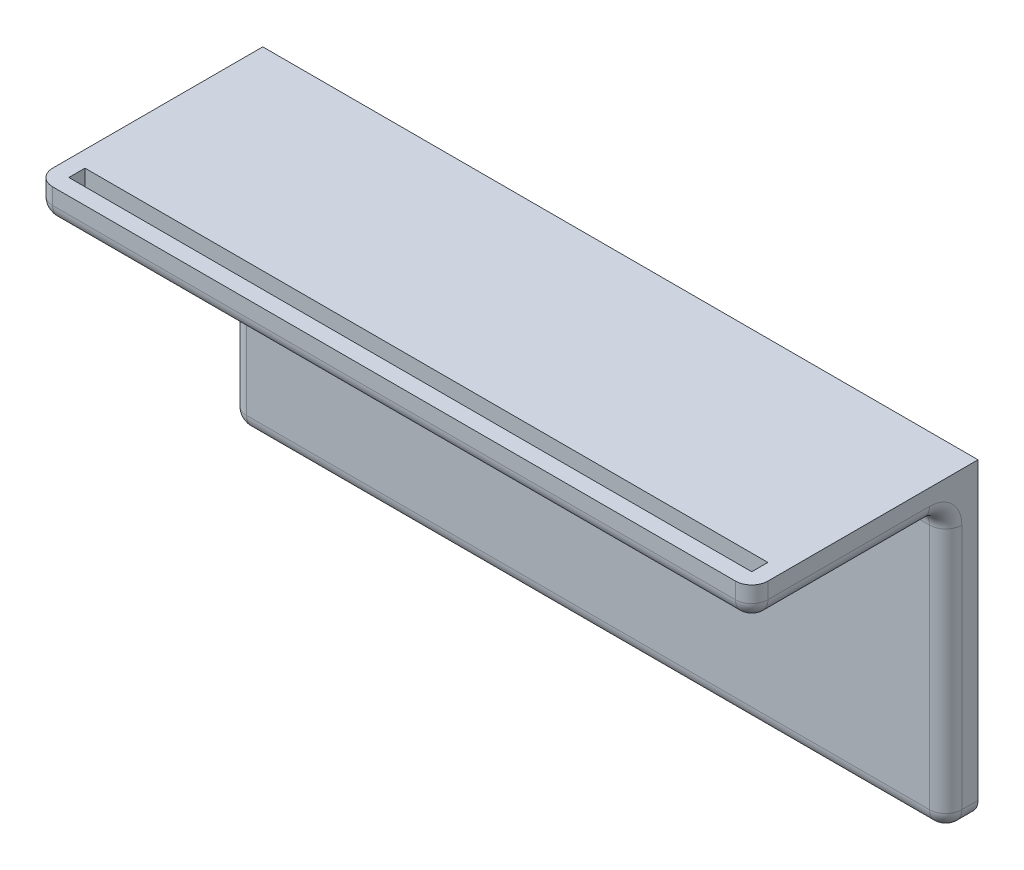
ISO-10303-21;
HEADER;
FILE_DESCRIPTION(('STEP AP214'),'2;1');
FILE_NAME('part.step','',(''),(''),'','','');
FILE_SCHEMA(('AUTOMOTIVE_DESIGN { 1 0 10303 214 1 1 1 1 }'));
ENDSEC;
DATA;
#1=APPLICATION_CONTEXT('core data for automotive mechanical design processes');
#2=APPLICATION_PROTOCOL_DEFINITION('international standard','automotive_design',2000,#1);
#3=PRODUCT_CONTEXT('',#1,'mechanical');
#4=PRODUCT('Part','Part','',(#3));
#5=PRODUCT_RELATED_PRODUCT_CATEGORY('part','',(#4));
#6=PRODUCT_DEFINITION_FORMATION('','',#4);
#7=PRODUCT_DEFINITION_CONTEXT('part definition',#1,'design');
#8=PRODUCT_DEFINITION('design','',#6,#7);
#9=PRODUCT_DEFINITION_SHAPE('','',#8);
#10=(LENGTH_UNIT() NAMED_UNIT(*) SI_UNIT(.MILLI.,.METRE.));
#11=(NAMED_UNIT(*) PLANE_ANGLE_UNIT() SI_UNIT($,.RADIAN.));
#12=(NAMED_UNIT(*) SI_UNIT($,.STERADIAN.) SOLID_ANGLE_UNIT());
#13=UNCERTAINTY_MEASURE_WITH_UNIT(LENGTH_MEASURE(1.E-05),#10,'distance_accuracy_value','');
#14=(GEOMETRIC_REPRESENTATION_CONTEXT(3) GLOBAL_UNCERTAINTY_ASSIGNED_CONTEXT((#13)) GLOBAL_UNIT_ASSIGNED_CONTEXT((#10,
#11,#12)) REPRESENTATION_CONTEXT('',''));
#15=CARTESIAN_POINT('',(0.,0.,0.));
#16=DIRECTION('',(0.,0.,1.));
#17=DIRECTION('',(1.,0.,0.));
#18=AXIS2_PLACEMENT_3D('',#15,#16,#17);
#19=CARTESIAN_POINT('',(-44.25,19.25,28.));
#20=DIRECTION('',(0.,-1.,0.));
#21=DIRECTION('',(1.,0.,0.));
#22=AXIS2_PLACEMENT_3D('',#19,#20,#21);
#23=PLANE('',#22);
#24=DIRECTION('',(1.,0.,0.));
#25=VECTOR('',#24,1.);
#26=CARTESIAN_POINT('',(42.25,19.25,26.));
#27=LINE('',#26,#25);
#28=CARTESIAN_POINT('',(-42.25,19.25,26.));
#29=VERTEX_POINT('',#28);
#30=CARTESIAN_POINT('',(42.25,19.25,26.));
#31=VERTEX_POINT('',#30);
#32=EDGE_CURVE('E217',#29,#31,#27,.T.);
#33=ORIENTED_EDGE('',*,*,#32,.F.);
#34=DIRECTION('',(0.,0.,1.));
#35=VECTOR('',#34,1.);
#36=CARTESIAN_POINT('',(-42.25,19.25,26.));
#37=LINE('',#36,#35);
#38=CARTESIAN_POINT('',(-42.25,19.25,24.));
#39=VERTEX_POINT('',#38);
#40=EDGE_CURVE('E65',#39,#29,#37,.T.);
#41=ORIENTED_EDGE('',*,*,#40,.F.);
#42=DIRECTION('',(-1.,0.,0.));
#43=VECTOR('',#42,1.);
#44=CARTESIAN_POINT('',(-42.25,19.25,24.));
#45=LINE('',#44,#43);
#46=CARTESIAN_POINT('',(42.25,19.25,24.));
#47=VERTEX_POINT('',#46);
#48=EDGE_CURVE('E204',#47,#39,#45,.T.);
#49=ORIENTED_EDGE('',*,*,#48,.F.);
#50=DIRECTION('',(0.,0.,-1.));
#51=VECTOR('',#50,1.);
#52=CARTESIAN_POINT('',(42.25,19.25,26.));
#53=LINE('',#52,#51);
#54=EDGE_CURVE('E208',#31,#47,#53,.T.);
#55=ORIENTED_EDGE('',*,*,#54,.F.);
#56=EDGE_LOOP('',(#33,#41,#49,#55));
#57=FACE_BOUND('',#56,.T.);
#58=DIRECTION('',(0.,0.,-1.));
#59=VECTOR('',#58,1.);
#60=CARTESIAN_POINT('',(-44.25,19.25,28.));
#61=LINE('',#60,#59);
#62=CARTESIAN_POINT('',(-44.25,19.25,26.));
#63=VERTEX_POINT('',#62);
#64=CARTESIAN_POINT('',(-44.25,19.25,0.));
#65=VERTEX_POINT('',#64);
#66=EDGE_CURVE('E255',#63,#65,#61,.T.);
#67=ORIENTED_EDGE('',*,*,#66,.F.);
#68=CARTESIAN_POINT('',(-42.25,19.25,26.));
#69=DIRECTION('',(0.,-1.,0.));
#70=DIRECTION('',(1.,0.,0.));
#71=AXIS2_PLACEMENT_3D('',#68,#69,#70);
#72=CIRCLE('',#71,2.);
#73=CARTESIAN_POINT('',(-42.25,19.25,28.));
#74=VERTEX_POINT('',#73);
#75=EDGE_CURVE('E373',#63,#74,#72,.F.);
#76=ORIENTED_EDGE('',*,*,#75,.T.);
#77=DIRECTION('',(-1.,0.,0.));
#78=VECTOR('',#77,1.);
#79=CARTESIAN_POINT('',(-44.25,19.25,28.));
#80=LINE('',#79,#78);
#81=CARTESIAN_POINT('',(42.25,19.25,28.));
#82=VERTEX_POINT('',#81);
#83=EDGE_CURVE('E232',#82,#74,#80,.T.);
#84=ORIENTED_EDGE('',*,*,#83,.F.);
#85=CARTESIAN_POINT('',(42.25,19.25,26.));
#86=DIRECTION('',(0.,-1.,0.));
#87=DIRECTION('',(1.,0.,0.));
#88=AXIS2_PLACEMENT_3D('',#85,#86,#87);
#89=CIRCLE('',#88,2.);
#90=CARTESIAN_POINT('',(44.25,19.25,26.));
#91=VERTEX_POINT('',#90);
#92=EDGE_CURVE('E282',#82,#91,#89,.F.);
#93=ORIENTED_EDGE('',*,*,#92,.T.);
#94=DIRECTION('',(0.,0.,-1.));
#95=VECTOR('',#94,1.);
#96=CARTESIAN_POINT('',(44.25,19.25,28.));
#97=LINE('',#96,#95);
#98=CARTESIAN_POINT('',(44.25,19.25,0.));
#99=VERTEX_POINT('',#98);
#100=EDGE_CURVE('E236',#91,#99,#97,.T.);
#101=ORIENTED_EDGE('',*,*,#100,.T.);
#102=DIRECTION('',(-1.,0.,0.));
#103=VECTOR('',#102,1.);
#104=CARTESIAN_POINT('',(-44.25,19.25,0.));
#105=LINE('',#104,#103);
#106=EDGE_CURVE('E238',#99,#65,#105,.T.);
#107=ORIENTED_EDGE('',*,*,#106,.T.);
#108=EDGE_LOOP('',(#67,#76,#84,#93,#101,#107));
#109=FACE_BOUND('',#108,.T.);
#110=ADVANCED_FACE('F47',(#57,#109),#23,.F.);
#111=CARTESIAN_POINT('',(-44.25,-19.25,28.));
#112=DIRECTION('',(1.,0.,0.));
#113=DIRECTION('',(0.,0.,-1.));
#114=AXIS2_PLACEMENT_3D('',#111,#112,#113);
#115=PLANE('',#114);
#116=DIRECTION('',(0.,-1.,0.));
#117=VECTOR('',#116,1.);
#118=CARTESIAN_POINT('',(-44.25,-19.25,0.));
#119=LINE('',#118,#117);
#120=CARTESIAN_POINT('',(-44.25,-17.25,0.));
#121=VERTEX_POINT('',#120);
#122=EDGE_CURVE('E242',#65,#121,#119,.T.);
#123=ORIENTED_EDGE('',*,*,#122,.T.);
#124=DIRECTION('',(0.,0.,-1.));
#125=VECTOR('',#124,1.);
#126=CARTESIAN_POINT('',(-44.25,-17.25,28.));
#127=LINE('',#126,#125);
#128=CARTESIAN_POINT('',(-44.25,-17.25,2.));
#129=VERTEX_POINT('',#128);
#130=EDGE_CURVE('E367',#121,#129,#127,.F.);
#131=ORIENTED_EDGE('',*,*,#130,.T.);
#132=DIRECTION('',(0.,1.,0.));
#133=VECTOR('',#132,1.);
#134=CARTESIAN_POINT('',(-44.25,-19.25,2.));
#135=LINE('',#134,#133);
#136=CARTESIAN_POINT('',(-44.25,13.25,2.));
#137=VERTEX_POINT('',#136);
#138=EDGE_CURVE('E361',#129,#137,#135,.T.);
#139=ORIENTED_EDGE('',*,*,#138,.T.);
#140=CARTESIAN_POINT('',(-44.25,13.25,6.));
#141=DIRECTION('',(1.,0.,0.));
#142=DIRECTION('',(0.,0.,-1.));
#143=AXIS2_PLACEMENT_3D('',#140,#141,#142);
#144=CIRCLE('',#143,4.);
#145=CARTESIAN_POINT('',(-44.25,17.25,6.));
#146=VERTEX_POINT('',#145);
#147=EDGE_CURVE('E358',#137,#146,#144,.T.);
#148=ORIENTED_EDGE('',*,*,#147,.T.);
#149=DIRECTION('',(0.,0.,1.));
#150=VECTOR('',#149,1.);
#151=CARTESIAN_POINT('',(-44.25,17.25,28.));
#152=LINE('',#151,#150);
#153=CARTESIAN_POINT('',(-44.25,17.25,26.));
#154=VERTEX_POINT('',#153);
#155=EDGE_CURVE('E355',#146,#154,#152,.T.);
#156=ORIENTED_EDGE('',*,*,#155,.T.);
#157=DIRECTION('',(0.,-1.,0.));
#158=VECTOR('',#157,1.);
#159=CARTESIAN_POINT('',(-44.25,19.25,26.));
#160=LINE('',#159,#158);
#161=EDGE_CURVE('E364',#154,#63,#160,.F.);
#162=ORIENTED_EDGE('',*,*,#161,.T.);
#163=ORIENTED_EDGE('',*,*,#66,.T.);
#164=EDGE_LOOP('',(#123,#131,#139,#148,#156,#162,#163));
#165=FACE_BOUND('',#164,.T.);
#166=ADVANCED_FACE('F419',(#165),#115,.F.);
#167=CARTESIAN_POINT('',(-44.25,-19.25,28.));
#168=DIRECTION('',(0.,1.,0.));
#169=DIRECTION('',(-1.,0.,0.));
#170=AXIS2_PLACEMENT_3D('',#167,#168,#169);
#171=PLANE('',#170);
#172=DIRECTION('',(1.,0.,0.));
#173=VECTOR('',#172,1.);
#174=CARTESIAN_POINT('',(-44.25,-19.25,2.));
#175=LINE('',#174,#173);
#176=CARTESIAN_POINT('',(42.25,-19.25,2.));
#177=VERTEX_POINT('',#176);
#178=CARTESIAN_POINT('',(-42.25,-19.25,2.));
#179=VERTEX_POINT('',#178);
#180=EDGE_CURVE('E274',#177,#179,#175,.F.);
#181=ORIENTED_EDGE('',*,*,#180,.T.);
#182=DIRECTION('',(0.,0.,-1.));
#183=VECTOR('',#182,1.);
#184=CARTESIAN_POINT('',(-42.25,-19.25,28.));
#185=LINE('',#184,#183);
#186=CARTESIAN_POINT('',(-42.25,-19.25,0.));
#187=VERTEX_POINT('',#186);
#188=EDGE_CURVE('E325',#179,#187,#185,.T.);
#189=ORIENTED_EDGE('',*,*,#188,.T.);
#190=DIRECTION('',(1.,0.,0.));
#191=VECTOR('',#190,1.);
#192=CARTESIAN_POINT('',(-44.25,-19.25,0.));
#193=LINE('',#192,#191);
#194=CARTESIAN_POINT('',(42.25,-19.25,0.));
#195=VERTEX_POINT('',#194);
#196=EDGE_CURVE('E247',#187,#195,#193,.T.);
#197=ORIENTED_EDGE('',*,*,#196,.T.);
#198=DIRECTION('',(0.,0.,-1.));
#199=VECTOR('',#198,1.);
#200=CARTESIAN_POINT('',(42.25,-19.25,28.));
#201=LINE('',#200,#199);
#202=EDGE_CURVE('E308',#195,#177,#201,.F.);
#203=ORIENTED_EDGE('',*,*,#202,.T.);
#204=EDGE_LOOP('',(#181,#189,#197,#203));
#205=FACE_BOUND('',#204,.T.);
#206=ADVANCED_FACE('F500',(#205),#171,.F.);
#207=CARTESIAN_POINT('',(44.25,-19.25,28.));
#208=DIRECTION('',(-1.,0.,0.));
#209=DIRECTION('',(0.,0.,1.));
#210=AXIS2_PLACEMENT_3D('',#207,#208,#209);
#211=PLANE('',#210);
#212=ORIENTED_EDGE('',*,*,#100,.F.);
#213=DIRECTION('',(0.,1.,0.));
#214=VECTOR('',#213,1.);
#215=CARTESIAN_POINT('',(44.25,17.25,26.));
#216=LINE('',#215,#214);
#217=CARTESIAN_POINT('',(44.25,17.25,26.));
#218=VERTEX_POINT('',#217);
#219=EDGE_CURVE('E297',#91,#218,#216,.F.);
#220=ORIENTED_EDGE('',*,*,#219,.T.);
#221=DIRECTION('',(0.,0.,1.));
#222=VECTOR('',#221,1.);
#223=CARTESIAN_POINT('',(44.25,17.25,28.));
#224=LINE('',#223,#222);
#225=CARTESIAN_POINT('',(44.25,17.25,6.));
#226=VERTEX_POINT('',#225);
#227=EDGE_CURVE('E291',#218,#226,#224,.F.);
#228=ORIENTED_EDGE('',*,*,#227,.T.);
#229=CARTESIAN_POINT('',(44.25,13.25,6.));
#230=DIRECTION('',(-1.,0.,0.));
#231=DIRECTION('',(0.,0.,1.));
#232=AXIS2_PLACEMENT_3D('',#229,#230,#231);
#233=CIRCLE('',#232,4.);
#234=CARTESIAN_POINT('',(44.25,13.25,2.));
#235=VERTEX_POINT('',#234);
#236=EDGE_CURVE('E288',#226,#235,#233,.T.);
#237=ORIENTED_EDGE('',*,*,#236,.T.);
#238=DIRECTION('',(0.,1.,0.));
#239=VECTOR('',#238,1.);
#240=CARTESIAN_POINT('',(44.25,-19.25,2.));
#241=LINE('',#240,#239);
#242=CARTESIAN_POINT('',(44.25,-17.25,2.));
#243=VERTEX_POINT('',#242);
#244=EDGE_CURVE('E285',#235,#243,#241,.F.);
#245=ORIENTED_EDGE('',*,*,#244,.T.);
#246=DIRECTION('',(0.,0.,-1.));
#247=VECTOR('',#246,1.);
#248=CARTESIAN_POINT('',(44.25,-17.25,28.));
#249=LINE('',#248,#247);
#250=CARTESIAN_POINT('',(44.25,-17.25,0.));
#251=VERTEX_POINT('',#250);
#252=EDGE_CURVE('E294',#243,#251,#249,.T.);
#253=ORIENTED_EDGE('',*,*,#252,.T.);
#254=DIRECTION('',(0.,1.,0.));
#255=VECTOR('',#254,1.);
#256=CARTESIAN_POINT('',(44.25,-19.25,0.));
#257=LINE('',#256,#255);
#258=EDGE_CURVE('E237',#251,#99,#257,.T.);
#259=ORIENTED_EDGE('',*,*,#258,.T.);
#260=EDGE_LOOP('',(#212,#220,#228,#237,#245,#253,#259));
#261=FACE_BOUND('',#260,.T.);
#262=ADVANCED_FACE('F479',(#261),#211,.F.);
#263=CARTESIAN_POINT('',(0.,0.,28.));
#264=DIRECTION('',(0.,0.,1.));
#265=DIRECTION('',(1.,0.,0.));
#266=AXIS2_PLACEMENT_3D('',#263,#264,#265);
#267=PLANE('',#266);
#268=ORIENTED_EDGE('',*,*,#83,.T.);
#269=DIRECTION('',(0.,-1.,0.));
#270=VECTOR('',#269,1.);
#271=CARTESIAN_POINT('',(-42.25,17.25,28.));
#272=LINE('',#271,#270);
#273=CARTESIAN_POINT('',(-42.25,17.25,28.));
#274=VERTEX_POINT('',#273);
#275=EDGE_CURVE('E370',#74,#274,#272,.T.);
#276=ORIENTED_EDGE('',*,*,#275,.T.);
#277=DIRECTION('',(1.,0.,0.));
#278=VECTOR('',#277,1.);
#279=CARTESIAN_POINT('',(44.25,17.25,28.));
#280=LINE('',#279,#278);
#281=CARTESIAN_POINT('',(42.25,17.25,28.));
#282=VERTEX_POINT('',#281);
#283=EDGE_CURVE('E265',#274,#282,#280,.T.);
#284=ORIENTED_EDGE('',*,*,#283,.T.);
#285=DIRECTION('',(0.,1.,0.));
#286=VECTOR('',#285,1.);
#287=CARTESIAN_POINT('',(42.25,19.25,28.));
#288=LINE('',#287,#286);
#289=EDGE_CURVE('E278',#282,#82,#288,.T.);
#290=ORIENTED_EDGE('',*,*,#289,.T.);
#291=EDGE_LOOP('',(#268,#276,#284,#290));
#292=FACE_BOUND('',#291,.T.);
#293=ADVANCED_FACE('F477',(#292),#267,.T.);
#294=CARTESIAN_POINT('',(0.,0.,0.));
#295=DIRECTION('',(0.,0.,1.));
#296=DIRECTION('',(1.,0.,0.));
#297=AXIS2_PLACEMENT_3D('',#294,#295,#296);
#298=PLANE('',#297);
#299=ORIENTED_EDGE('',*,*,#196,.F.);
#300=CARTESIAN_POINT('',(-42.25,-17.25,0.));
#301=DIRECTION('',(0.,0.,1.));
#302=DIRECTION('',(1.,0.,0.));
#303=AXIS2_PLACEMENT_3D('',#300,#301,#302);
#304=CIRCLE('',#303,2.);
#305=EDGE_CURVE('E352',#187,#121,#304,.F.);
#306=ORIENTED_EDGE('',*,*,#305,.T.);
#307=ORIENTED_EDGE('',*,*,#122,.F.);
#308=ORIENTED_EDGE('',*,*,#106,.F.);
#309=ORIENTED_EDGE('',*,*,#258,.F.);
#310=CARTESIAN_POINT('',(42.25,-17.25,0.));
#311=DIRECTION('',(0.,0.,1.));
#312=DIRECTION('',(1.,0.,0.));
#313=AXIS2_PLACEMENT_3D('',#310,#311,#312);
#314=CIRCLE('',#313,2.);
#315=EDGE_CURVE('E304',#251,#195,#314,.F.);
#316=ORIENTED_EDGE('',*,*,#315,.T.);
#317=EDGE_LOOP('',(#299,#306,#307,#308,#309,#316));
#318=FACE_BOUND('',#317,.T.);
#319=ADVANCED_FACE('F428',(#318),#298,.F.);
#320=CARTESIAN_POINT('',(-44.25,15.25,4.));
#321=DIRECTION('',(0.,1.,0.));
#322=DIRECTION('',(0.,0.,1.));
#323=AXIS2_PLACEMENT_3D('',#320,#321,#322);
#324=PLANE('',#323);
#325=DIRECTION('',(1.,0.,0.));
#326=VECTOR('',#325,1.);
#327=CARTESIAN_POINT('',(-44.25,15.25,26.));
#328=LINE('',#327,#326);
#329=CARTESIAN_POINT('',(42.25,15.25,26.));
#330=VERTEX_POINT('',#329);
#331=CARTESIAN_POINT('',(-42.25,15.25,26.));
#332=VERTEX_POINT('',#331);
#333=EDGE_CURVE('E268',#330,#332,#328,.F.);
#334=ORIENTED_EDGE('',*,*,#333,.T.);
#335=DIRECTION('',(0.,0.,1.));
#336=VECTOR('',#335,1.);
#337=CARTESIAN_POINT('',(-42.25,15.25,4.));
#338=LINE('',#337,#336);
#339=CARTESIAN_POINT('',(-42.25,15.25,6.));
#340=VERTEX_POINT('',#339);
#341=EDGE_CURVE('E57',#332,#340,#338,.F.);
#342=ORIENTED_EDGE('',*,*,#341,.T.);
#343=DIRECTION('',(1.,0.,0.));
#344=VECTOR('',#343,1.);
#345=CARTESIAN_POINT('',(44.25,15.25,6.));
#346=LINE('',#345,#344);
#347=CARTESIAN_POINT('',(42.25,15.25,6.));
#348=VERTEX_POINT('',#347);
#349=EDGE_CURVE('E258',#340,#348,#346,.T.);
#350=ORIENTED_EDGE('',*,*,#349,.T.);
#351=DIRECTION('',(0.,0.,1.));
#352=VECTOR('',#351,1.);
#353=CARTESIAN_POINT('',(42.25,15.25,4.));
#354=LINE('',#353,#352);
#355=EDGE_CURVE('E311',#348,#330,#354,.T.);
#356=ORIENTED_EDGE('',*,*,#355,.T.);
#357=EDGE_LOOP('',(#334,#342,#350,#356));
#358=FACE_BOUND('',#357,.T.);
#359=ADVANCED_FACE('F452',(#358),#324,.F.);
#360=CARTESIAN_POINT('',(-44.25,-19.25,4.));
#361=DIRECTION('',(0.,0.,-1.));
#362=DIRECTION('',(-1.,0.,0.));
#363=AXIS2_PLACEMENT_3D('',#360,#361,#362);
#364=PLANE('',#363);
#365=DIRECTION('',(1.,0.,0.));
#366=VECTOR('',#365,1.);
#367=CARTESIAN_POINT('',(-44.25,13.25,4.));
#368=LINE('',#367,#366);
#369=CARTESIAN_POINT('',(42.25,13.25,4.));
#370=VERTEX_POINT('',#369);
#371=CARTESIAN_POINT('',(-42.25,13.25,4.));
#372=VERTEX_POINT('',#371);
#373=EDGE_CURVE('E261',#370,#372,#368,.F.);
#374=ORIENTED_EDGE('',*,*,#373,.T.);
#375=DIRECTION('',(0.,1.,0.));
#376=VECTOR('',#375,1.);
#377=CARTESIAN_POINT('',(-42.25,-19.25,4.));
#378=LINE('',#377,#376);
#379=CARTESIAN_POINT('',(-42.25,-17.25,4.));
#380=VERTEX_POINT('',#379);
#381=EDGE_CURVE('E379',#372,#380,#378,.F.);
#382=ORIENTED_EDGE('',*,*,#381,.T.);
#383=DIRECTION('',(1.,0.,0.));
#384=VECTOR('',#383,1.);
#385=CARTESIAN_POINT('',(-44.25,-17.25,4.));
#386=LINE('',#385,#384);
#387=CARTESIAN_POINT('',(42.25,-17.25,4.));
#388=VERTEX_POINT('',#387);
#389=EDGE_CURVE('E271',#380,#388,#386,.T.);
#390=ORIENTED_EDGE('',*,*,#389,.T.);
#391=DIRECTION('',(0.,1.,0.));
#392=VECTOR('',#391,1.);
#393=CARTESIAN_POINT('',(42.25,-19.25,4.));
#394=LINE('',#393,#392);
#395=EDGE_CURVE('E318',#388,#370,#394,.T.);
#396=ORIENTED_EDGE('',*,*,#395,.T.);
#397=EDGE_LOOP('',(#374,#382,#390,#396));
#398=FACE_BOUND('',#397,.T.);
#399=ADVANCED_FACE('F494',(#398),#364,.F.);
#400=CARTESIAN_POINT('',(-44.25,13.25,6.));
#401=DIRECTION('',(-1.,0.,0.));
#402=DIRECTION('',(0.,0.,1.));
#403=AXIS2_PLACEMENT_3D('',#400,#401,#402);
#404=CYLINDRICAL_SURFACE('',#403,2.);
#405=ORIENTED_EDGE('',*,*,#349,.F.);
#406=CARTESIAN_POINT('',(-42.25,13.25,6.));
#407=DIRECTION('',(1.,0.,0.));
#408=DIRECTION('',(0.,0.,-1.));
#409=AXIS2_PLACEMENT_3D('',#406,#407,#408);
#410=CIRCLE('',#409,2.);
#411=EDGE_CURVE('E382',#340,#372,#410,.F.);
#412=ORIENTED_EDGE('',*,*,#411,.T.);
#413=ORIENTED_EDGE('',*,*,#373,.F.);
#414=CARTESIAN_POINT('',(42.25,13.25,6.));
#415=DIRECTION('',(-1.,0.,0.));
#416=DIRECTION('',(0.,0.,1.));
#417=AXIS2_PLACEMENT_3D('',#414,#415,#416);
#418=CIRCLE('',#417,2.);
#419=EDGE_CURVE('E314',#370,#348,#418,.F.);
#420=ORIENTED_EDGE('',*,*,#419,.T.);
#421=EDGE_LOOP('',(#405,#412,#413,#420));
#422=FACE_BOUND('',#421,.T.);
#423=ADVANCED_FACE('F454',(#422),#404,.F.);
#424=CARTESIAN_POINT('',(0.,17.25,26.));
#425=DIRECTION('',(-1.,0.,0.));
#426=DIRECTION('',(0.,0.,1.));
#427=AXIS2_PLACEMENT_3D('',#424,#425,#426);
#428=CYLINDRICAL_SURFACE('',#427,2.);
#429=ORIENTED_EDGE('',*,*,#283,.F.);
#430=CARTESIAN_POINT('',(-42.25,17.25,26.));
#431=DIRECTION('',(-1.,0.,0.));
#432=DIRECTION('',(0.,0.,1.));
#433=AXIS2_PLACEMENT_3D('',#430,#431,#432);
#434=CIRCLE('',#433,2.);
#435=EDGE_CURVE('E11',#274,#332,#434,.F.);
#436=ORIENTED_EDGE('',*,*,#435,.T.);
#437=ORIENTED_EDGE('',*,*,#333,.F.);
#438=CARTESIAN_POINT('',(42.25,17.25,26.));
#439=DIRECTION('',(-1.,0.,0.));
#440=DIRECTION('',(0.,0.,1.));
#441=AXIS2_PLACEMENT_3D('',#438,#439,#440);
#442=CIRCLE('',#441,2.);
#443=EDGE_CURVE('E300',#330,#282,#442,.T.);
#444=ORIENTED_EDGE('',*,*,#443,.T.);
#445=EDGE_LOOP('',(#429,#436,#437,#444));
#446=FACE_BOUND('',#445,.T.);
#447=ADVANCED_FACE('F468',(#446),#428,.T.);
#448=CARTESIAN_POINT('',(-44.25,-17.25,2.));
#449=DIRECTION('',(1.,0.,0.));
#450=DIRECTION('',(0.,1.,0.));
#451=AXIS2_PLACEMENT_3D('',#448,#449,#450);
#452=CYLINDRICAL_SURFACE('',#451,2.);
#453=ORIENTED_EDGE('',*,*,#389,.F.);
#454=CARTESIAN_POINT('',(-42.25,-17.25,2.));
#455=DIRECTION('',(1.,0.,0.));
#456=DIRECTION('',(0.,1.,0.));
#457=AXIS2_PLACEMENT_3D('',#454,#455,#456);
#458=CIRCLE('',#457,2.);
#459=EDGE_CURVE('E376',#380,#179,#458,.T.);
#460=ORIENTED_EDGE('',*,*,#459,.T.);
#461=ORIENTED_EDGE('',*,*,#180,.F.);
#462=CARTESIAN_POINT('',(42.25,-17.25,2.));
#463=DIRECTION('',(1.,0.,0.));
#464=DIRECTION('',(0.,1.,0.));
#465=AXIS2_PLACEMENT_3D('',#462,#463,#464);
#466=CIRCLE('',#465,2.);
#467=EDGE_CURVE('E321',#177,#388,#466,.F.);
#468=ORIENTED_EDGE('',*,*,#467,.T.);
#469=EDGE_LOOP('',(#453,#460,#461,#468));
#470=FACE_BOUND('',#469,.T.);
#471=ADVANCED_FACE('F498',(#470),#452,.T.);
#472=CARTESIAN_POINT('',(42.25,-17.25,28.));
#473=DIRECTION('',(0.,0.,-1.));
#474=DIRECTION('',(-1.,0.,0.));
#475=AXIS2_PLACEMENT_3D('',#472,#473,#474);
#476=CYLINDRICAL_SURFACE('',#475,2.);
#477=CARTESIAN_POINT('',(42.25,-17.25,2.));
#478=DIRECTION('',(0.,0.,1.));
#479=DIRECTION('',(1.,0.,0.));
#480=AXIS2_PLACEMENT_3D('',#477,#478,#479);
#481=CIRCLE('',#480,2.);
#482=EDGE_CURVE('E243',#177,#243,#481,.T.);
#483=ORIENTED_EDGE('',*,*,#482,.F.);
#484=ORIENTED_EDGE('',*,*,#202,.F.);
#485=ORIENTED_EDGE('',*,*,#315,.F.);
#486=ORIENTED_EDGE('',*,*,#252,.F.);
#487=EDGE_LOOP('',(#483,#484,#485,#486));
#488=FACE_BOUND('',#487,.T.);
#489=ADVANCED_FACE('F484',(#488),#476,.T.);
#490=CARTESIAN_POINT('',(42.25,-17.25,2.));
#491=DIRECTION('',(-1.,0.,0.));
#492=DIRECTION('',(0.,0.,1.));
#493=AXIS2_PLACEMENT_3D('',#490,#491,#492);
#494=SPHERICAL_SURFACE('',#493,2.);
#495=ORIENTED_EDGE('',*,*,#467,.F.);
#496=ORIENTED_EDGE('',*,*,#482,.T.);
#497=CARTESIAN_POINT('',(42.25,-17.25,2.));
#498=DIRECTION('',(0.,1.,0.));
#499=DIRECTION('',(0.,0.,1.));
#500=AXIS2_PLACEMENT_3D('',#497,#498,#499);
#501=CIRCLE('',#500,2.);
#502=EDGE_CURVE('E342',#388,#243,#501,.T.);
#503=ORIENTED_EDGE('',*,*,#502,.F.);
#504=EDGE_LOOP('',(#495,#496,#503));
#505=FACE_BOUND('',#504,.T.);
#506=ADVANCED_FACE('F489',(#505),#494,.T.);
#507=CARTESIAN_POINT('',(42.25,-19.25,2.));
#508=DIRECTION('',(0.,1.,0.));
#509=DIRECTION('',(0.,0.,1.));
#510=AXIS2_PLACEMENT_3D('',#507,#508,#509);
#511=CYLINDRICAL_SURFACE('',#510,2.);
#512=ORIENTED_EDGE('',*,*,#502,.T.);
#513=ORIENTED_EDGE('',*,*,#244,.F.);
#514=CARTESIAN_POINT('',(42.25,13.25,2.));
#515=DIRECTION('',(0.,1.,0.));
#516=DIRECTION('',(0.,0.,1.));
#517=AXIS2_PLACEMENT_3D('',#514,#515,#516);
#518=CIRCLE('',#517,2.);
#519=EDGE_CURVE('E338',#370,#235,#518,.T.);
#520=ORIENTED_EDGE('',*,*,#519,.F.);
#521=ORIENTED_EDGE('',*,*,#395,.F.);
#522=EDGE_LOOP('',(#512,#513,#520,#521));
#523=FACE_BOUND('',#522,.T.);
#524=ADVANCED_FACE('F492',(#523),#511,.T.);
#525=CARTESIAN_POINT('',(42.25,13.25,6.));
#526=DIRECTION('',(-1.,0.,0.));
#527=DIRECTION('',(0.,0.,1.));
#528=AXIS2_PLACEMENT_3D('',#525,#526,#527);
#529=TOROIDAL_SURFACE('',#528,4.,2.);
#530=ORIENTED_EDGE('',*,*,#519,.T.);
#531=ORIENTED_EDGE('',*,*,#236,.F.);
#532=CARTESIAN_POINT('',(42.25,17.25,6.));
#533=DIRECTION('',(0.,0.,1.));
#534=DIRECTION('',(1.,0.,0.));
#535=AXIS2_PLACEMENT_3D('',#532,#533,#534);
#536=CIRCLE('',#535,2.);
#537=EDGE_CURVE('E334',#348,#226,#536,.T.);
#538=ORIENTED_EDGE('',*,*,#537,.F.);
#539=ORIENTED_EDGE('',*,*,#419,.F.);
#540=EDGE_LOOP('',(#530,#531,#538,#539));
#541=FACE_BOUND('',#540,.T.);
#542=ADVANCED_FACE('F462',(#541),#529,.T.);
#543=CARTESIAN_POINT('',(42.25,17.25,4.));
#544=DIRECTION('',(0.,0.,1.));
#545=DIRECTION('',(1.,0.,0.));
#546=AXIS2_PLACEMENT_3D('',#543,#544,#545);
#547=CYLINDRICAL_SURFACE('',#546,2.);
#548=CARTESIAN_POINT('',(42.25,17.25,26.));
#549=DIRECTION('',(0.,0.,1.));
#550=DIRECTION('',(1.,0.,0.));
#551=AXIS2_PLACEMENT_3D('',#548,#549,#550);
#552=CIRCLE('',#551,2.);
#553=EDGE_CURVE('E330',#330,#218,#552,.T.);
#554=ORIENTED_EDGE('',*,*,#553,.F.);
#555=ORIENTED_EDGE('',*,*,#355,.F.);
#556=ORIENTED_EDGE('',*,*,#537,.T.);
#557=ORIENTED_EDGE('',*,*,#227,.F.);
#558=EDGE_LOOP('',(#554,#555,#556,#557));
#559=FACE_BOUND('',#558,.T.);
#560=ADVANCED_FACE('F466',(#559),#547,.T.);
#561=CARTESIAN_POINT('',(42.25,17.25,26.));
#562=DIRECTION('',(-1.,0.,0.));
#563=DIRECTION('',(0.,0.,1.));
#564=AXIS2_PLACEMENT_3D('',#561,#562,#563);
#565=SPHERICAL_SURFACE('',#564,2.);
#566=ORIENTED_EDGE('',*,*,#443,.F.);
#567=ORIENTED_EDGE('',*,*,#553,.T.);
#568=CARTESIAN_POINT('',(42.25,17.25,26.));
#569=DIRECTION('',(0.,1.,0.));
#570=DIRECTION('',(0.,0.,1.));
#571=AXIS2_PLACEMENT_3D('',#568,#569,#570);
#572=CIRCLE('',#571,2.);
#573=EDGE_CURVE('E326',#282,#218,#572,.T.);
#574=ORIENTED_EDGE('',*,*,#573,.F.);
#575=EDGE_LOOP('',(#566,#567,#574));
#576=FACE_BOUND('',#575,.T.);
#577=ADVANCED_FACE('F472',(#576),#565,.T.);
#578=CARTESIAN_POINT('',(42.25,0.,26.));
#579=DIRECTION('',(0.,-1.,0.));
#580=DIRECTION('',(0.,0.,-1.));
#581=AXIS2_PLACEMENT_3D('',#578,#579,#580);
#582=CYLINDRICAL_SURFACE('',#581,2.);
#583=ORIENTED_EDGE('',*,*,#573,.T.);
#584=ORIENTED_EDGE('',*,*,#219,.F.);
#585=ORIENTED_EDGE('',*,*,#92,.F.);
#586=ORIENTED_EDGE('',*,*,#289,.F.);
#587=EDGE_LOOP('',(#583,#584,#585,#586));
#588=FACE_BOUND('',#587,.T.);
#589=ADVANCED_FACE('F475',(#588),#582,.T.);
#590=CARTESIAN_POINT('',(-42.25,0.,26.));
#591=DIRECTION('',(0.,1.,0.));
#592=DIRECTION('',(0.,0.,1.));
#593=AXIS2_PLACEMENT_3D('',#590,#591,#592);
#594=CYLINDRICAL_SURFACE('',#593,2.);
#595=CARTESIAN_POINT('',(-42.25,17.25,26.));
#596=DIRECTION('',(0.,-1.,0.));
#597=DIRECTION('',(0.,0.,-1.));
#598=AXIS2_PLACEMENT_3D('',#595,#596,#597);
#599=CIRCLE('',#598,2.);
#600=EDGE_CURVE('E51',#274,#154,#599,.T.);
#601=ORIENTED_EDGE('',*,*,#600,.F.);
#602=ORIENTED_EDGE('',*,*,#275,.F.);
#603=ORIENTED_EDGE('',*,*,#75,.F.);
#604=ORIENTED_EDGE('',*,*,#161,.F.);
#605=EDGE_LOOP('',(#601,#602,#603,#604));
#606=FACE_BOUND('',#605,.T.);
#607=ADVANCED_FACE('F49',(#606),#594,.T.);
#608=CARTESIAN_POINT('',(-42.25,17.25,26.));
#609=DIRECTION('',(1.,0.,0.));
#610=DIRECTION('',(0.,0.,-1.));
#611=AXIS2_PLACEMENT_3D('',#608,#609,#610);
#612=SPHERICAL_SURFACE('',#611,2.);
#613=ORIENTED_EDGE('',*,*,#435,.F.);
#614=ORIENTED_EDGE('',*,*,#600,.T.);
#615=CARTESIAN_POINT('',(-42.25,17.25,26.));
#616=DIRECTION('',(0.,0.,-1.));
#617=DIRECTION('',(-1.,0.,0.));
#618=AXIS2_PLACEMENT_3D('',#615,#616,#617);
#619=CIRCLE('',#618,2.);
#620=EDGE_CURVE('E401',#332,#154,#619,.T.);
#621=ORIENTED_EDGE('',*,*,#620,.F.);
#622=EDGE_LOOP('',(#613,#614,#621));
#623=FACE_BOUND('',#622,.T.);
#624=ADVANCED_FACE('F412',(#623),#612,.T.);
#625=CARTESIAN_POINT('',(-42.25,17.25,28.));
#626=DIRECTION('',(0.,0.,1.));
#627=DIRECTION('',(1.,0.,0.));
#628=AXIS2_PLACEMENT_3D('',#625,#626,#627);
#629=CYLINDRICAL_SURFACE('',#628,2.);
#630=ORIENTED_EDGE('',*,*,#620,.T.);
#631=ORIENTED_EDGE('',*,*,#155,.F.);
#632=CARTESIAN_POINT('',(-42.25,17.25,6.));
#633=DIRECTION('',(0.,0.,-1.));
#634=DIRECTION('',(-1.,0.,0.));
#635=AXIS2_PLACEMENT_3D('',#632,#633,#634);
#636=CIRCLE('',#635,2.);
#637=EDGE_CURVE('E398',#340,#146,#636,.T.);
#638=ORIENTED_EDGE('',*,*,#637,.F.);
#639=ORIENTED_EDGE('',*,*,#341,.F.);
#640=EDGE_LOOP('',(#630,#631,#638,#639));
#641=FACE_BOUND('',#640,.T.);
#642=ADVANCED_FACE('F449',(#641),#629,.T.);
#643=CARTESIAN_POINT('',(-42.25,13.25,6.));
#644=DIRECTION('',(1.,0.,0.));
#645=DIRECTION('',(0.,0.,-1.));
#646=AXIS2_PLACEMENT_3D('',#643,#644,#645);
#647=TOROIDAL_SURFACE('',#646,4.,2.);
#648=ORIENTED_EDGE('',*,*,#637,.T.);
#649=ORIENTED_EDGE('',*,*,#147,.F.);
#650=CARTESIAN_POINT('',(-42.25,13.25,2.));
#651=DIRECTION('',(0.,-1.,0.));
#652=DIRECTION('',(0.,0.,-1.));
#653=AXIS2_PLACEMENT_3D('',#650,#651,#652);
#654=CIRCLE('',#653,2.);
#655=EDGE_CURVE('E394',#372,#137,#654,.T.);
#656=ORIENTED_EDGE('',*,*,#655,.F.);
#657=ORIENTED_EDGE('',*,*,#411,.F.);
#658=EDGE_LOOP('',(#648,#649,#656,#657));
#659=FACE_BOUND('',#658,.T.);
#660=ADVANCED_FACE('F446',(#659),#647,.T.);
#661=CARTESIAN_POINT('',(-42.25,-19.25,2.));
#662=DIRECTION('',(0.,1.,0.));
#663=DIRECTION('',(0.,0.,1.));
#664=AXIS2_PLACEMENT_3D('',#661,#662,#663);
#665=CYLINDRICAL_SURFACE('',#664,2.);
#666=CARTESIAN_POINT('',(-42.25,-17.25,2.));
#667=DIRECTION('',(0.,-1.,0.));
#668=DIRECTION('',(0.,0.,-1.));
#669=AXIS2_PLACEMENT_3D('',#666,#667,#668);
#670=CIRCLE('',#669,2.);
#671=EDGE_CURVE('E390',#380,#129,#670,.T.);
#672=ORIENTED_EDGE('',*,*,#671,.F.);
#673=ORIENTED_EDGE('',*,*,#381,.F.);
#674=ORIENTED_EDGE('',*,*,#655,.T.);
#675=ORIENTED_EDGE('',*,*,#138,.F.);
#676=EDGE_LOOP('',(#672,#673,#674,#675));
#677=FACE_BOUND('',#676,.T.);
#678=ADVANCED_FACE('F442',(#677),#665,.T.);
#679=CARTESIAN_POINT('',(-42.25,-17.25,2.));
#680=DIRECTION('',(1.,0.,0.));
#681=DIRECTION('',(0.,0.,-1.));
#682=AXIS2_PLACEMENT_3D('',#679,#680,#681);
#683=SPHERICAL_SURFACE('',#682,2.);
#684=ORIENTED_EDGE('',*,*,#459,.F.);
#685=ORIENTED_EDGE('',*,*,#671,.T.);
#686=CARTESIAN_POINT('',(-42.25,-17.25,2.));
#687=DIRECTION('',(0.,0.,-1.));
#688=DIRECTION('',(0.,1.,0.));
#689=AXIS2_PLACEMENT_3D('',#686,#687,#688);
#690=CIRCLE('',#689,2.);
#691=EDGE_CURVE('E226',#179,#129,#690,.T.);
#692=ORIENTED_EDGE('',*,*,#691,.F.);
#693=EDGE_LOOP('',(#684,#685,#692));
#694=FACE_BOUND('',#693,.T.);
#695=ADVANCED_FACE('F438',(#694),#683,.T.);
#696=CARTESIAN_POINT('',(-42.25,-17.25,28.));
#697=DIRECTION('',(0.,0.,-1.));
#698=DIRECTION('',(-1.,0.,0.));
#699=AXIS2_PLACEMENT_3D('',#696,#697,#698);
#700=CYLINDRICAL_SURFACE('',#699,2.);
#701=ORIENTED_EDGE('',*,*,#691,.T.);
#702=ORIENTED_EDGE('',*,*,#130,.F.);
#703=ORIENTED_EDGE('',*,*,#305,.F.);
#704=ORIENTED_EDGE('',*,*,#188,.F.);
#705=EDGE_LOOP('',(#701,#702,#703,#704));
#706=FACE_BOUND('',#705,.T.);
#707=ADVANCED_FACE('F433',(#706),#700,.T.);
#708=CARTESIAN_POINT('',(-42.25,17.25,26.));
#709=DIRECTION('',(-1.,0.,0.));
#710=DIRECTION('',(0.,0.,1.));
#711=AXIS2_PLACEMENT_3D('',#708,#709,#710);
#712=PLANE('',#711);
#713=ORIENTED_EDGE('',*,*,#40,.T.);
#714=DIRECTION('',(0.,1.,0.));
#715=VECTOR('',#714,1.);
#716=CARTESIAN_POINT('',(-42.25,17.25,26.));
#717=LINE('',#716,#715);
#718=CARTESIAN_POINT('',(-42.25,17.25,26.));
#719=VERTEX_POINT('',#718);
#720=EDGE_CURVE('E179',#719,#29,#717,.T.);
#721=ORIENTED_EDGE('',*,*,#720,.F.);
#722=DIRECTION('',(0.,0.,1.));
#723=VECTOR('',#722,1.);
#724=CARTESIAN_POINT('',(-42.25,17.25,26.));
#725=LINE('',#724,#723);
#726=CARTESIAN_POINT('',(-42.25,17.25,24.));
#727=VERTEX_POINT('',#726);
#728=EDGE_CURVE('E183',#727,#719,#725,.T.);
#729=ORIENTED_EDGE('',*,*,#728,.F.);
#730=DIRECTION('',(0.,1.,0.));
#731=VECTOR('',#730,1.);
#732=CARTESIAN_POINT('',(-42.25,17.25,24.));
#733=LINE('',#732,#731);
#734=EDGE_CURVE('E223',#727,#39,#733,.T.);
#735=ORIENTED_EDGE('',*,*,#734,.T.);
#736=EDGE_LOOP('',(#713,#721,#729,#735));
#737=FACE_BOUND('',#736,.T.);
#738=ADVANCED_FACE('F181',(#737),#712,.F.);
#739=CARTESIAN_POINT('',(-42.25,17.25,24.));
#740=DIRECTION('',(0.,0.,-1.));
#741=DIRECTION('',(-1.,0.,0.));
#742=AXIS2_PLACEMENT_3D('',#739,#740,#741);
#743=PLANE('',#742);
#744=ORIENTED_EDGE('',*,*,#48,.T.);
#745=ORIENTED_EDGE('',*,*,#734,.F.);
#746=DIRECTION('',(-1.,0.,0.));
#747=VECTOR('',#746,1.);
#748=CARTESIAN_POINT('',(-42.25,17.25,24.));
#749=LINE('',#748,#747);
#750=CARTESIAN_POINT('',(42.25,17.25,24.));
#751=VERTEX_POINT('',#750);
#752=EDGE_CURVE('E190',#751,#727,#749,.T.);
#753=ORIENTED_EDGE('',*,*,#752,.F.);
#754=DIRECTION('',(0.,1.,0.));
#755=VECTOR('',#754,1.);
#756=CARTESIAN_POINT('',(42.25,17.25,24.));
#757=LINE('',#756,#755);
#758=EDGE_CURVE('E227',#751,#47,#757,.T.);
#759=ORIENTED_EDGE('',*,*,#758,.T.);
#760=EDGE_LOOP('',(#744,#745,#753,#759));
#761=FACE_BOUND('',#760,.T.);
#762=ADVANCED_FACE('F707',(#761),#743,.F.);
#763=CARTESIAN_POINT('',(42.25,17.25,26.));
#764=DIRECTION('',(1.,0.,0.));
#765=DIRECTION('',(0.,1.,0.));
#766=AXIS2_PLACEMENT_3D('',#763,#764,#765);
#767=PLANE('',#766);
#768=ORIENTED_EDGE('',*,*,#54,.T.);
#769=ORIENTED_EDGE('',*,*,#758,.F.);
#770=DIRECTION('',(0.,0.,-1.));
#771=VECTOR('',#770,1.);
#772=CARTESIAN_POINT('',(42.25,17.25,26.));
#773=LINE('',#772,#771);
#774=CARTESIAN_POINT('',(42.25,17.25,26.));
#775=VERTEX_POINT('',#774);
#776=EDGE_CURVE('E199',#775,#751,#773,.T.);
#777=ORIENTED_EDGE('',*,*,#776,.F.);
#778=DIRECTION('',(0.,1.,0.));
#779=VECTOR('',#778,1.);
#780=CARTESIAN_POINT('',(42.25,17.25,26.));
#781=LINE('',#780,#779);
#782=EDGE_CURVE('E189',#775,#31,#781,.T.);
#783=ORIENTED_EDGE('',*,*,#782,.T.);
#784=EDGE_LOOP('',(#768,#769,#777,#783));
#785=FACE_BOUND('',#784,.T.);
#786=ADVANCED_FACE('F715',(#785),#767,.F.);
#787=CARTESIAN_POINT('',(42.25,17.25,26.));
#788=DIRECTION('',(0.,0.,1.));
#789=DIRECTION('',(1.,0.,0.));
#790=AXIS2_PLACEMENT_3D('',#787,#788,#789);
#791=PLANE('',#790);
#792=ORIENTED_EDGE('',*,*,#32,.T.);
#793=ORIENTED_EDGE('',*,*,#782,.F.);
#794=DIRECTION('',(1.,0.,0.));
#795=VECTOR('',#794,1.);
#796=CARTESIAN_POINT('',(42.25,17.25,26.));
#797=LINE('',#796,#795);
#798=EDGE_CURVE('E193',#719,#775,#797,.T.);
#799=ORIENTED_EDGE('',*,*,#798,.F.);
#800=ORIENTED_EDGE('',*,*,#720,.T.);
#801=EDGE_LOOP('',(#792,#793,#799,#800));
#802=FACE_BOUND('',#801,.T.);
#803=ADVANCED_FACE('F194',(#802),#791,.F.);
#804=CARTESIAN_POINT('',(0.,17.25,0.));
#805=DIRECTION('',(0.,-1.,0.));
#806=DIRECTION('',(1.,0.,0.));
#807=AXIS2_PLACEMENT_3D('',#804,#805,#806);
#808=PLANE('',#807);
#809=ORIENTED_EDGE('',*,*,#728,.T.);
#810=ORIENTED_EDGE('',*,*,#798,.T.);
#811=ORIENTED_EDGE('',*,*,#776,.T.);
#812=ORIENTED_EDGE('',*,*,#752,.T.);
#813=EDGE_LOOP('',(#809,#810,#811,#812));
#814=FACE_BOUND('',#813,.T.);
#815=ADVANCED_FACE('F201',(#814),#808,.F.);
#816=CLOSED_SHELL('',(#110,#166,#206,#262,#293,#319,#359,#399,#423,#447,#471,#489,#506,#524,
#542,#560,#577,#589,#607,#624,#642,#660,#678,#695,#707,#738,#762,#786,#803,#815));
#817=MANIFOLD_SOLID_BREP('B2',#816);
#818=ADVANCED_BREP_SHAPE_REPRESENTATION('',(#18,#817),#14);
#819=SHAPE_DEFINITION_REPRESENTATION(#9,#818);
ENDSEC;
END-ISO-10303-21;
